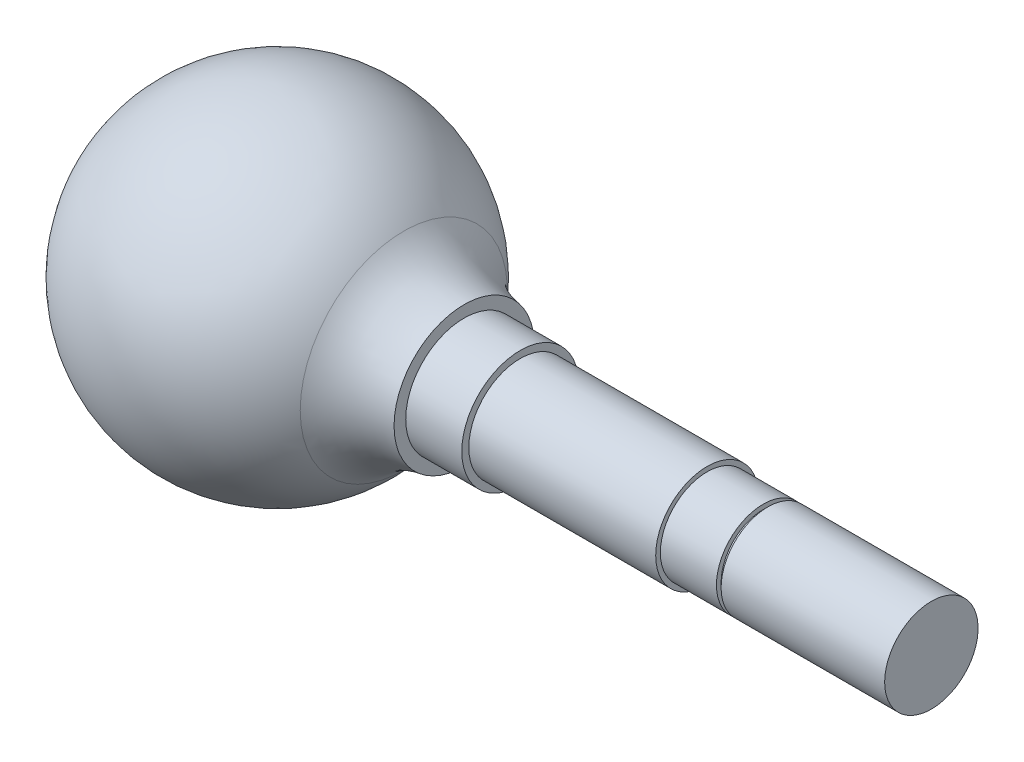
ISO-10303-21;
HEADER;
FILE_DESCRIPTION(('STEP AP214'),'2;1');
FILE_NAME('part.step','',(''),(''),'','','');
FILE_SCHEMA(('AUTOMOTIVE_DESIGN { 1 0 10303 214 1 1 1 1 }'));
ENDSEC;
DATA;
#1=APPLICATION_CONTEXT('core data for automotive mechanical design processes');
#2=APPLICATION_PROTOCOL_DEFINITION('international standard','automotive_design',2000,#1);
#3=PRODUCT_CONTEXT('',#1,'mechanical');
#4=PRODUCT('Part','Part','',(#3));
#5=PRODUCT_RELATED_PRODUCT_CATEGORY('part','',(#4));
#6=PRODUCT_DEFINITION_FORMATION('','',#4);
#7=PRODUCT_DEFINITION_CONTEXT('part definition',#1,'design');
#8=PRODUCT_DEFINITION('design','',#6,#7);
#9=PRODUCT_DEFINITION_SHAPE('','',#8);
#10=(LENGTH_UNIT() NAMED_UNIT(*) SI_UNIT(.MILLI.,.METRE.));
#11=(NAMED_UNIT(*) PLANE_ANGLE_UNIT() SI_UNIT($,.RADIAN.));
#12=(NAMED_UNIT(*) SI_UNIT($,.STERADIAN.) SOLID_ANGLE_UNIT());
#13=UNCERTAINTY_MEASURE_WITH_UNIT(LENGTH_MEASURE(1.E-05),#10,'distance_accuracy_value','');
#14=(GEOMETRIC_REPRESENTATION_CONTEXT(3) GLOBAL_UNCERTAINTY_ASSIGNED_CONTEXT((#13)) GLOBAL_UNIT_ASSIGNED_CONTEXT((#10,
#11,#12)) REPRESENTATION_CONTEXT('',''));
#15=CARTESIAN_POINT('',(0.,0.,0.));
#16=DIRECTION('',(0.,0.,1.));
#17=DIRECTION('',(1.,0.,0.));
#18=AXIS2_PLACEMENT_3D('',#15,#16,#17);
#19=CARTESIAN_POINT('',(40.,12.5,0.));
#20=DIRECTION('',(-1.,0.,0.));
#21=DIRECTION('',(0.,0.,1.));
#22=AXIS2_PLACEMENT_3D('',#19,#20,#21);
#23=PLANE('',#22);
#24=CARTESIAN_POINT('',(40.,0.,0.));
#25=DIRECTION('',(-1.,0.,0.));
#26=DIRECTION('',(0.,0.,1.));
#27=AXIS2_PLACEMENT_3D('',#24,#25,#26);
#28=CIRCLE('',#27,15.);
#29=CARTESIAN_POINT('',(40.,0.,15.));
#30=VERTEX_POINT('',#29);
#31=EDGE_CURVE('E41',#30,#30,#28,.T.);
#32=ORIENTED_EDGE('',*,*,#31,.F.);
#33=EDGE_LOOP('',(#32));
#34=FACE_BOUND('',#33,.T.);
#35=CARTESIAN_POINT('',(40.,0.,0.));
#36=DIRECTION('',(-1.,0.,0.));
#37=DIRECTION('',(0.,0.,1.));
#38=AXIS2_PLACEMENT_3D('',#35,#36,#37);
#39=CIRCLE('',#38,12.5);
#40=CARTESIAN_POINT('',(40.,0.,12.5));
#41=VERTEX_POINT('',#40);
#42=EDGE_CURVE('E45',#41,#41,#39,.T.);
#43=ORIENTED_EDGE('',*,*,#42,.T.);
#44=EDGE_LOOP('',(#43));
#45=FACE_BOUND('',#44,.T.);
#46=ADVANCED_FACE('F34',(#34,#45),#23,.F.);
#47=CARTESIAN_POINT('',(0.,0.,0.));
#48=DIRECTION('',(-1.,0.,0.));
#49=DIRECTION('',(0.,0.,1.));
#50=AXIS2_PLACEMENT_3D('',#47,#48,#49);
#51=CYLINDRICAL_SURFACE('',#50,12.5);
#52=ORIENTED_EDGE('',*,*,#42,.F.);
#53=EDGE_LOOP('',(#52));
#54=FACE_BOUND('',#53,.T.);
#55=CARTESIAN_POINT('',(52.,0.,0.));
#56=DIRECTION('',(-1.,0.,0.));
#57=DIRECTION('',(0.,0.,1.));
#58=AXIS2_PLACEMENT_3D('',#55,#56,#57);
#59=CIRCLE('',#58,12.5);
#60=CARTESIAN_POINT('',(52.,0.,12.5));
#61=VERTEX_POINT('',#60);
#62=EDGE_CURVE('E49',#61,#61,#59,.T.);
#63=ORIENTED_EDGE('',*,*,#62,.T.);
#64=EDGE_LOOP('',(#63));
#65=FACE_BOUND('',#64,.T.);
#66=ADVANCED_FACE('F93',(#54,#65),#51,.T.);
#67=CARTESIAN_POINT('',(52.,11.,0.));
#68=DIRECTION('',(-1.,0.,0.));
#69=DIRECTION('',(0.,0.,1.));
#70=AXIS2_PLACEMENT_3D('',#67,#68,#69);
#71=PLANE('',#70);
#72=ORIENTED_EDGE('',*,*,#62,.F.);
#73=EDGE_LOOP('',(#72));
#74=FACE_BOUND('',#73,.T.);
#75=CARTESIAN_POINT('',(52.,0.,0.));
#76=DIRECTION('',(-1.,0.,0.));
#77=DIRECTION('',(0.,0.,1.));
#78=AXIS2_PLACEMENT_3D('',#75,#76,#77);
#79=CIRCLE('',#78,11.);
#80=CARTESIAN_POINT('',(52.,0.,11.));
#81=VERTEX_POINT('',#80);
#82=EDGE_CURVE('E54',#81,#81,#79,.T.);
#83=ORIENTED_EDGE('',*,*,#82,.T.);
#84=EDGE_LOOP('',(#83));
#85=FACE_BOUND('',#84,.T.);
#86=ADVANCED_FACE('F99',(#74,#85),#71,.F.);
#87=CARTESIAN_POINT('',(0.,0.,0.));
#88=DIRECTION('',(-1.,0.,0.));
#89=DIRECTION('',(0.,0.,1.));
#90=AXIS2_PLACEMENT_3D('',#87,#88,#89);
#91=CYLINDRICAL_SURFACE('',#90,11.);
#92=ORIENTED_EDGE('',*,*,#82,.F.);
#93=EDGE_LOOP('',(#92));
#94=FACE_BOUND('',#93,.T.);
#95=CARTESIAN_POINT('',(92.,0.,0.));
#96=DIRECTION('',(-1.,0.,0.));
#97=DIRECTION('',(0.,0.,1.));
#98=AXIS2_PLACEMENT_3D('',#95,#96,#97);
#99=CIRCLE('',#98,11.);
#100=CARTESIAN_POINT('',(92.,0.,11.));
#101=VERTEX_POINT('',#100);
#102=EDGE_CURVE('E57',#101,#101,#99,.T.);
#103=ORIENTED_EDGE('',*,*,#102,.T.);
#104=EDGE_LOOP('',(#103));
#105=FACE_BOUND('',#104,.T.);
#106=ADVANCED_FACE('F106',(#94,#105),#91,.T.);
#107=CARTESIAN_POINT('',(92.,11.,0.));
#108=DIRECTION('',(-1.,0.,0.));
#109=DIRECTION('',(0.,0.,1.));
#110=AXIS2_PLACEMENT_3D('',#107,#108,#109);
#111=PLANE('',#110);
#112=ORIENTED_EDGE('',*,*,#102,.F.);
#113=EDGE_LOOP('',(#112));
#114=FACE_BOUND('',#113,.T.);
#115=CARTESIAN_POINT('',(92.,0.,0.));
#116=DIRECTION('',(-1.,0.,0.));
#117=DIRECTION('',(0.,0.,1.));
#118=AXIS2_PLACEMENT_3D('',#115,#116,#117);
#119=CIRCLE('',#118,10.);
#120=CARTESIAN_POINT('',(92.,0.,10.));
#121=VERTEX_POINT('',#120);
#122=EDGE_CURVE('E60',#121,#121,#119,.T.);
#123=ORIENTED_EDGE('',*,*,#122,.T.);
#124=EDGE_LOOP('',(#123));
#125=FACE_BOUND('',#124,.T.);
#126=ADVANCED_FACE('F110',(#114,#125),#111,.F.);
#127=CARTESIAN_POINT('',(0.,0.,0.));
#128=DIRECTION('',(-1.,0.,0.));
#129=DIRECTION('',(0.,0.,1.));
#130=AXIS2_PLACEMENT_3D('',#127,#128,#129);
#131=CYLINDRICAL_SURFACE('',#130,10.);
#132=ORIENTED_EDGE('',*,*,#122,.F.);
#133=EDGE_LOOP('',(#132));
#134=FACE_BOUND('',#133,.T.);
#135=CARTESIAN_POINT('',(104.,0.,0.));
#136=DIRECTION('',(-1.,0.,0.));
#137=DIRECTION('',(0.,0.,1.));
#138=AXIS2_PLACEMENT_3D('',#135,#136,#137);
#139=CIRCLE('',#138,10.);
#140=CARTESIAN_POINT('',(104.,0.,10.));
#141=VERTEX_POINT('',#140);
#142=EDGE_CURVE('E63',#141,#141,#139,.T.);
#143=ORIENTED_EDGE('',*,*,#142,.T.);
#144=EDGE_LOOP('',(#143));
#145=FACE_BOUND('',#144,.T.);
#146=ADVANCED_FACE('F114',(#134,#145),#131,.T.);
#147=CARTESIAN_POINT('',(104.,10.,0.));
#148=DIRECTION('',(-1.,0.,0.));
#149=DIRECTION('',(0.,0.,1.));
#150=AXIS2_PLACEMENT_3D('',#147,#148,#149);
#151=PLANE('',#150);
#152=ORIENTED_EDGE('',*,*,#142,.F.);
#153=EDGE_LOOP('',(#152));
#154=FACE_BOUND('',#153,.T.);
#155=CARTESIAN_POINT('',(104.,0.,0.));
#156=DIRECTION('',(-1.,0.,0.));
#157=DIRECTION('',(0.,0.,1.));
#158=AXIS2_PLACEMENT_3D('',#155,#156,#157);
#159=CIRCLE('',#158,9.);
#160=CARTESIAN_POINT('',(104.,0.,9.));
#161=VERTEX_POINT('',#160);
#162=EDGE_CURVE('E66',#161,#161,#159,.T.);
#163=ORIENTED_EDGE('',*,*,#162,.T.);
#164=EDGE_LOOP('',(#163));
#165=FACE_BOUND('',#164,.T.);
#166=ADVANCED_FACE('F118',(#154,#165),#151,.F.);
#167=CARTESIAN_POINT('',(0.,0.,0.));
#168=DIRECTION('',(-1.,0.,0.));
#169=DIRECTION('',(0.,0.,1.));
#170=AXIS2_PLACEMENT_3D('',#167,#168,#169);
#171=CYLINDRICAL_SURFACE('',#170,9.);
#172=ORIENTED_EDGE('',*,*,#162,.F.);
#173=EDGE_LOOP('',(#172));
#174=FACE_BOUND('',#173,.T.);
#175=CARTESIAN_POINT('',(105.,0.,0.));
#176=DIRECTION('',(-1.,0.,0.));
#177=DIRECTION('',(0.,0.,1.));
#178=AXIS2_PLACEMENT_3D('',#175,#176,#177);
#179=CIRCLE('',#178,9.);
#180=CARTESIAN_POINT('',(105.,0.,9.));
#181=VERTEX_POINT('',#180);
#182=EDGE_CURVE('E69',#181,#181,#179,.T.);
#183=ORIENTED_EDGE('',*,*,#182,.T.);
#184=EDGE_LOOP('',(#183));
#185=FACE_BOUND('',#184,.T.);
#186=ADVANCED_FACE('F122',(#174,#185),#171,.T.);
#187=CARTESIAN_POINT('',(105.,9.,0.));
#188=DIRECTION('',(1.,0.,0.));
#189=DIRECTION('',(0.,0.,-1.));
#190=AXIS2_PLACEMENT_3D('',#187,#188,#189);
#191=PLANE('',#190);
#192=ORIENTED_EDGE('',*,*,#182,.F.);
#193=EDGE_LOOP('',(#192));
#194=FACE_BOUND('',#193,.T.);
#195=CARTESIAN_POINT('',(105.,0.,0.));
#196=DIRECTION('',(-1.,0.,0.));
#197=DIRECTION('',(0.,0.,1.));
#198=AXIS2_PLACEMENT_3D('',#195,#196,#197);
#199=CIRCLE('',#198,10.);
#200=CARTESIAN_POINT('',(105.,0.,10.));
#201=VERTEX_POINT('',#200);
#202=EDGE_CURVE('E72',#201,#201,#199,.T.);
#203=ORIENTED_EDGE('',*,*,#202,.T.);
#204=EDGE_LOOP('',(#203));
#205=FACE_BOUND('',#204,.T.);
#206=ADVANCED_FACE('F89',(#194,#205),#191,.F.);
#207=CARTESIAN_POINT('',(0.,0.,0.));
#208=DIRECTION('',(-1.,0.,0.));
#209=DIRECTION('',(0.,0.,1.));
#210=AXIS2_PLACEMENT_3D('',#207,#208,#209);
#211=CYLINDRICAL_SURFACE('',#210,10.);
#212=ORIENTED_EDGE('',*,*,#202,.F.);
#213=EDGE_LOOP('',(#212));
#214=FACE_BOUND('',#213,.T.);
#215=CARTESIAN_POINT('',(140.,0.,0.));
#216=DIRECTION('',(-1.,0.,0.));
#217=DIRECTION('',(0.,0.,1.));
#218=AXIS2_PLACEMENT_3D('',#215,#216,#217);
#219=CIRCLE('',#218,10.);
#220=CARTESIAN_POINT('',(140.,0.,10.));
#221=VERTEX_POINT('',#220);
#222=EDGE_CURVE('E75',#221,#221,#219,.T.);
#223=ORIENTED_EDGE('',*,*,#222,.T.);
#224=EDGE_LOOP('',(#223));
#225=FACE_BOUND('',#224,.T.);
#226=ADVANCED_FACE('F79',(#214,#225),#211,.T.);
#227=CARTESIAN_POINT('',(140.,10.,0.));
#228=DIRECTION('',(-1.,0.,0.));
#229=DIRECTION('',(0.,0.,1.));
#230=AXIS2_PLACEMENT_3D('',#227,#228,#229);
#231=PLANE('',#230);
#232=ORIENTED_EDGE('',*,*,#222,.F.);
#233=EDGE_LOOP('',(#232));
#234=FACE_BOUND('',#233,.T.);
#235=ADVANCED_FACE('F81',(#234),#231,.F.);
#236=CARTESIAN_POINT('',(0.,0.,0.));
#237=DIRECTION('',(0.,1.,0.));
#238=DIRECTION('',(1.,0.,0.));
#239=AXIS2_PLACEMENT_3D('',#236,#237,#238);
#240=SPHERICAL_SURFACE('',#239,35.);
#241=CARTESIAN_POINT('',(0.,0.,0.));
#242=DIRECTION('',(-1.,0.,0.));
#243=DIRECTION('',(0.,0.,1.));
#244=AXIS2_PLACEMENT_3D('',#241,#242,#243);
#245=SPHERICAL_SURFACE('',#244,35.);
#246=CARTESIAN_POINT('',(27.0847690375919,0.,0.));
#247=DIRECTION('',(-1.,0.,0.));
#248=DIRECTION('',(0.,0.,1.));
#249=AXIS2_PLACEMENT_3D('',#246,#247,#248);
#250=CIRCLE('',#249,22.1678886270277);
#251=CARTESIAN_POINT('',(27.0847690375919,0.,22.1678886270277));
#252=VERTEX_POINT('',#251);
#253=EDGE_CURVE('E10',#252,#252,#250,.T.);
#254=ORIENTED_EDGE('',*,*,#253,.T.);
#255=EDGE_LOOP('',(#254));
#256=FACE_BOUND('',#255,.T.);
#257=ADVANCED_FACE('F83',(#256),#245,.T.);
#258=CARTESIAN_POINT('',(42.5617799162158,0.,0.));
#259=DIRECTION('',(-1.,0.,0.));
#260=DIRECTION('',(0.,0.,1.));
#261=AXIS2_PLACEMENT_3D('',#258,#259,#260);
#262=TOROIDAL_SURFACE('',#261,34.8352535567578,20.);
#263=ORIENTED_EDGE('',*,*,#31,.T.);
#264=EDGE_LOOP('',(#263));
#265=FACE_BOUND('',#264,.T.);
#266=ORIENTED_EDGE('',*,*,#253,.F.);
#267=EDGE_LOOP('',(#266));
#268=FACE_BOUND('',#267,.T.);
#269=ADVANCED_FACE('F36',(#265,#268),#262,.F.);
#270=CLOSED_SHELL('',(#46,#66,#86,#106,#126,#146,#166,#186,#206,#226,#235,#257,#269));
#271=MANIFOLD_SOLID_BREP('B2',#270);
#272=ADVANCED_BREP_SHAPE_REPRESENTATION('',(#18,#271),#14);
#273=SHAPE_DEFINITION_REPRESENTATION(#9,#272);
ENDSEC;
END-ISO-10303-21;
